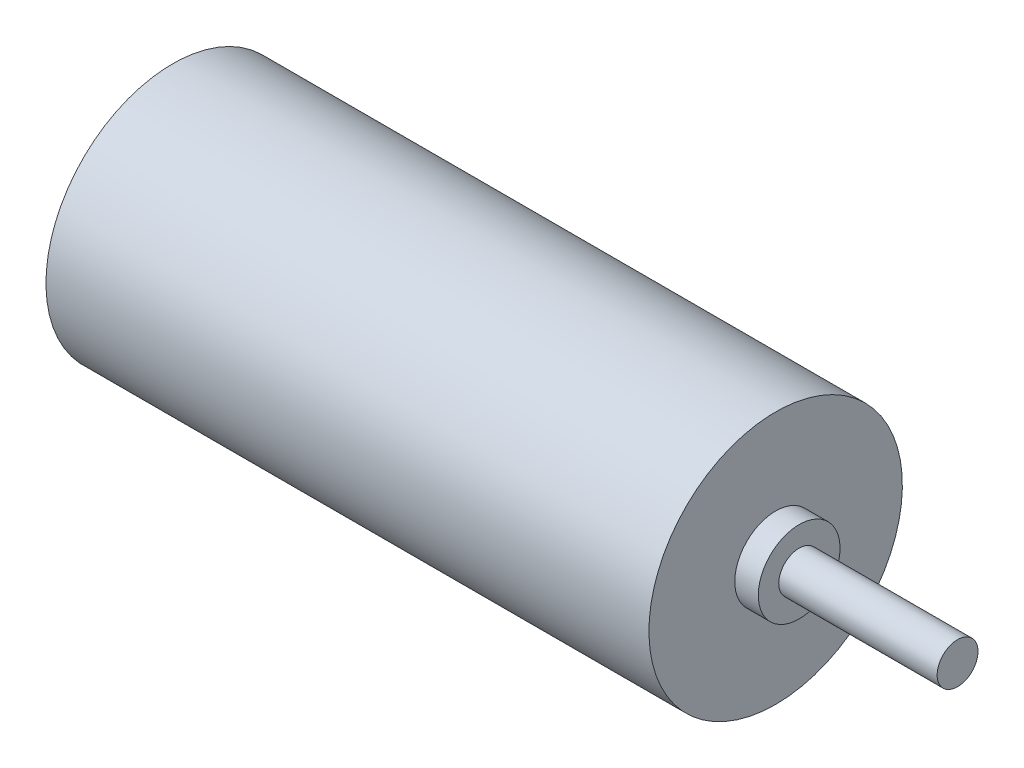
ISO-10303-21;
HEADER;
FILE_DESCRIPTION(('STEP AP214'),'2;1');
FILE_NAME('part.step','',(''),(''),'','','');
FILE_SCHEMA(('AUTOMOTIVE_DESIGN { 1 0 10303 214 1 1 1 1 }'));
ENDSEC;
DATA;
#1=APPLICATION_CONTEXT('core data for automotive mechanical design processes');
#2=APPLICATION_PROTOCOL_DEFINITION('international standard','automotive_design',2000,#1);
#3=PRODUCT_CONTEXT('',#1,'mechanical');
#4=PRODUCT('Part','Part','',(#3));
#5=PRODUCT_RELATED_PRODUCT_CATEGORY('part','',(#4));
#6=PRODUCT_DEFINITION_FORMATION('','',#4);
#7=PRODUCT_DEFINITION_CONTEXT('part definition',#1,'design');
#8=PRODUCT_DEFINITION('design','',#6,#7);
#9=PRODUCT_DEFINITION_SHAPE('','',#8);
#10=(LENGTH_UNIT() NAMED_UNIT(*) SI_UNIT(.MILLI.,.METRE.));
#11=(NAMED_UNIT(*) PLANE_ANGLE_UNIT() SI_UNIT($,.RADIAN.));
#12=(NAMED_UNIT(*) SI_UNIT($,.STERADIAN.) SOLID_ANGLE_UNIT());
#13=UNCERTAINTY_MEASURE_WITH_UNIT(LENGTH_MEASURE(1.E-05),#10,'distance_accuracy_value','');
#14=(GEOMETRIC_REPRESENTATION_CONTEXT(3) GLOBAL_UNCERTAINTY_ASSIGNED_CONTEXT((#13)) GLOBAL_UNIT_ASSIGNED_CONTEXT((#10,
#11,#12)) REPRESENTATION_CONTEXT('',''));
#15=CARTESIAN_POINT('',(0.,0.,0.));
#16=DIRECTION('',(0.,0.,1.));
#17=DIRECTION('',(1.,0.,0.));
#18=AXIS2_PLACEMENT_3D('',#15,#16,#17);
#19=CARTESIAN_POINT('',(0.,0.,0.));
#20=DIRECTION('',(1.,0.,0.));
#21=DIRECTION('',(0.,1.,0.));
#22=AXIS2_PLACEMENT_3D('',#19,#20,#21);
#23=PLANE('',#22);
#24=CARTESIAN_POINT('',(0.,0.,0.));
#25=DIRECTION('',(1.,0.,0.));
#26=DIRECTION('',(0.,1.,0.));
#27=AXIS2_PLACEMENT_3D('',#24,#25,#26);
#28=CIRCLE('',#27,12.4);
#29=CARTESIAN_POINT('',(0.,-12.4,0.));
#30=VERTEX_POINT('',#29);
#31=EDGE_CURVE('E11',#30,#30,#28,.T.);
#32=ORIENTED_EDGE('',*,*,#31,.F.);
#33=EDGE_LOOP('',(#32));
#34=FACE_BOUND('',#33,.T.);
#35=ADVANCED_FACE('F17',(#34),#23,.F.);
#36=CARTESIAN_POINT('',(0.,0.,0.));
#37=DIRECTION('',(1.,0.,0.));
#38=DIRECTION('',(0.,1.,0.));
#39=AXIS2_PLACEMENT_3D('',#36,#37,#38);
#40=CYLINDRICAL_SURFACE('',#39,12.4);
#41=CARTESIAN_POINT('',(59.,0.,0.));
#42=DIRECTION('',(1.,0.,0.));
#43=DIRECTION('',(0.,1.,0.));
#44=AXIS2_PLACEMENT_3D('',#41,#42,#43);
#45=CIRCLE('',#44,12.4);
#46=CARTESIAN_POINT('',(59.,-12.4,0.));
#47=VERTEX_POINT('',#46);
#48=EDGE_CURVE('E85',#47,#47,#45,.T.);
#49=ORIENTED_EDGE('',*,*,#48,.F.);
#50=DIRECTION('',(-1.,0.,0.));
#51=VECTOR('',#50,1.);
#52=CARTESIAN_POINT('',(0.,-12.4,0.));
#53=LINE('',#52,#51);
#54=EDGE_CURVE('E27',#47,#30,#53,.T.);
#55=ORIENTED_EDGE('',*,*,#54,.T.);
#56=ORIENTED_EDGE('',*,*,#31,.T.);
#57=ORIENTED_EDGE('',*,*,#54,.F.);
#58=EDGE_LOOP('',(#49,#55,#56,#57));
#59=FACE_BOUND('',#58,.T.);
#60=ADVANCED_FACE('F104',(#59),#40,.T.);
#61=CARTESIAN_POINT('',(59.,0.,0.));
#62=DIRECTION('',(1.,0.,0.));
#63=DIRECTION('',(0.,1.,0.));
#64=AXIS2_PLACEMENT_3D('',#61,#62,#63);
#65=PLANE('',#64);
#66=CARTESIAN_POINT('',(59.,0.,0.));
#67=DIRECTION('',(-1.,0.,0.));
#68=DIRECTION('',(0.,1.,0.));
#69=AXIS2_PLACEMENT_3D('',#66,#67,#68);
#70=CIRCLE('',#69,4.);
#71=CARTESIAN_POINT('',(59.,-4.,0.));
#72=VERTEX_POINT('',#71);
#73=EDGE_CURVE('E81',#72,#72,#70,.T.);
#74=ORIENTED_EDGE('',*,*,#73,.T.);
#75=EDGE_LOOP('',(#74));
#76=FACE_BOUND('',#75,.T.);
#77=ORIENTED_EDGE('',*,*,#48,.T.);
#78=EDGE_LOOP('',(#77));
#79=FACE_BOUND('',#78,.T.);
#80=ADVANCED_FACE('F93',(#76,#79),#65,.T.);
#81=CARTESIAN_POINT('',(61.3,0.,0.));
#82=DIRECTION('',(1.,0.,0.));
#83=DIRECTION('',(0.,1.,0.));
#84=AXIS2_PLACEMENT_3D('',#81,#82,#83);
#85=PLANE('',#84);
#86=CARTESIAN_POINT('',(61.3,0.,0.));
#87=DIRECTION('',(-1.,0.,0.));
#88=DIRECTION('',(0.,1.,0.));
#89=AXIS2_PLACEMENT_3D('',#86,#87,#88);
#90=CIRCLE('',#89,2.);
#91=CARTESIAN_POINT('',(61.3,-2.,0.));
#92=VERTEX_POINT('',#91);
#93=EDGE_CURVE('E64',#92,#92,#90,.T.);
#94=ORIENTED_EDGE('',*,*,#93,.T.);
#95=EDGE_LOOP('',(#94));
#96=FACE_BOUND('',#95,.T.);
#97=CARTESIAN_POINT('',(61.3,0.,0.));
#98=DIRECTION('',(1.,0.,0.));
#99=DIRECTION('',(0.,1.,0.));
#100=AXIS2_PLACEMENT_3D('',#97,#98,#99);
#101=CIRCLE('',#100,4.);
#102=CARTESIAN_POINT('',(61.3,-4.,0.));
#103=VERTEX_POINT('',#102);
#104=EDGE_CURVE('E69',#103,#103,#101,.T.);
#105=ORIENTED_EDGE('',*,*,#104,.T.);
#106=EDGE_LOOP('',(#105));
#107=FACE_BOUND('',#106,.T.);
#108=ADVANCED_FACE('F19',(#96,#107),#85,.T.);
#109=CARTESIAN_POINT('',(59.,0.,0.));
#110=DIRECTION('',(1.,0.,0.));
#111=DIRECTION('',(0.,1.,0.));
#112=AXIS2_PLACEMENT_3D('',#109,#110,#111);
#113=CYLINDRICAL_SURFACE('',#112,4.);
#114=ORIENTED_EDGE('',*,*,#104,.F.);
#115=DIRECTION('',(-1.,0.,0.));
#116=VECTOR('',#115,1.);
#117=CARTESIAN_POINT('',(59.,-4.,0.));
#118=LINE('',#117,#116);
#119=EDGE_CURVE('E56',#103,#72,#118,.T.);
#120=ORIENTED_EDGE('',*,*,#119,.T.);
#121=ORIENTED_EDGE('',*,*,#73,.F.);
#122=ORIENTED_EDGE('',*,*,#119,.F.);
#123=EDGE_LOOP('',(#114,#120,#121,#122));
#124=FACE_BOUND('',#123,.T.);
#125=ADVANCED_FACE('F95',(#124),#113,.T.);
#126=CARTESIAN_POINT('',(76.8,0.,0.));
#127=DIRECTION('',(1.,0.,0.));
#128=DIRECTION('',(0.,1.,0.));
#129=AXIS2_PLACEMENT_3D('',#126,#127,#128);
#130=PLANE('',#129);
#131=CARTESIAN_POINT('',(76.8,0.,0.));
#132=DIRECTION('',(1.,0.,0.));
#133=DIRECTION('',(0.,1.,0.));
#134=AXIS2_PLACEMENT_3D('',#131,#132,#133);
#135=CIRCLE('',#134,2.);
#136=CARTESIAN_POINT('',(76.8,-2.,0.));
#137=VERTEX_POINT('',#136);
#138=EDGE_CURVE('E76',#137,#137,#135,.T.);
#139=ORIENTED_EDGE('',*,*,#138,.T.);
#140=EDGE_LOOP('',(#139));
#141=FACE_BOUND('',#140,.T.);
#142=ADVANCED_FACE('F102',(#141),#130,.T.);
#143=CARTESIAN_POINT('',(61.3,0.,0.));
#144=DIRECTION('',(1.,0.,0.));
#145=DIRECTION('',(0.,1.,0.));
#146=AXIS2_PLACEMENT_3D('',#143,#144,#145);
#147=CYLINDRICAL_SURFACE('',#146,2.);
#148=ORIENTED_EDGE('',*,*,#138,.F.);
#149=DIRECTION('',(-1.,0.,0.));
#150=VECTOR('',#149,1.);
#151=CARTESIAN_POINT('',(61.3,-2.,0.));
#152=LINE('',#151,#150);
#153=EDGE_CURVE('E70',#137,#92,#152,.T.);
#154=ORIENTED_EDGE('',*,*,#153,.T.);
#155=ORIENTED_EDGE('',*,*,#93,.F.);
#156=ORIENTED_EDGE('',*,*,#153,.F.);
#157=EDGE_LOOP('',(#148,#154,#155,#156));
#158=FACE_BOUND('',#157,.T.);
#159=ADVANCED_FACE('F115',(#158),#147,.T.);
#160=CLOSED_SHELL('',(#35,#60,#80,#108,#125,#142,#159));
#161=MANIFOLD_SOLID_BREP('B1',#160);
#162=ADVANCED_BREP_SHAPE_REPRESENTATION('',(#18,#161),#14);
#163=SHAPE_DEFINITION_REPRESENTATION(#9,#162);
ENDSEC;
END-ISO-10303-21;
